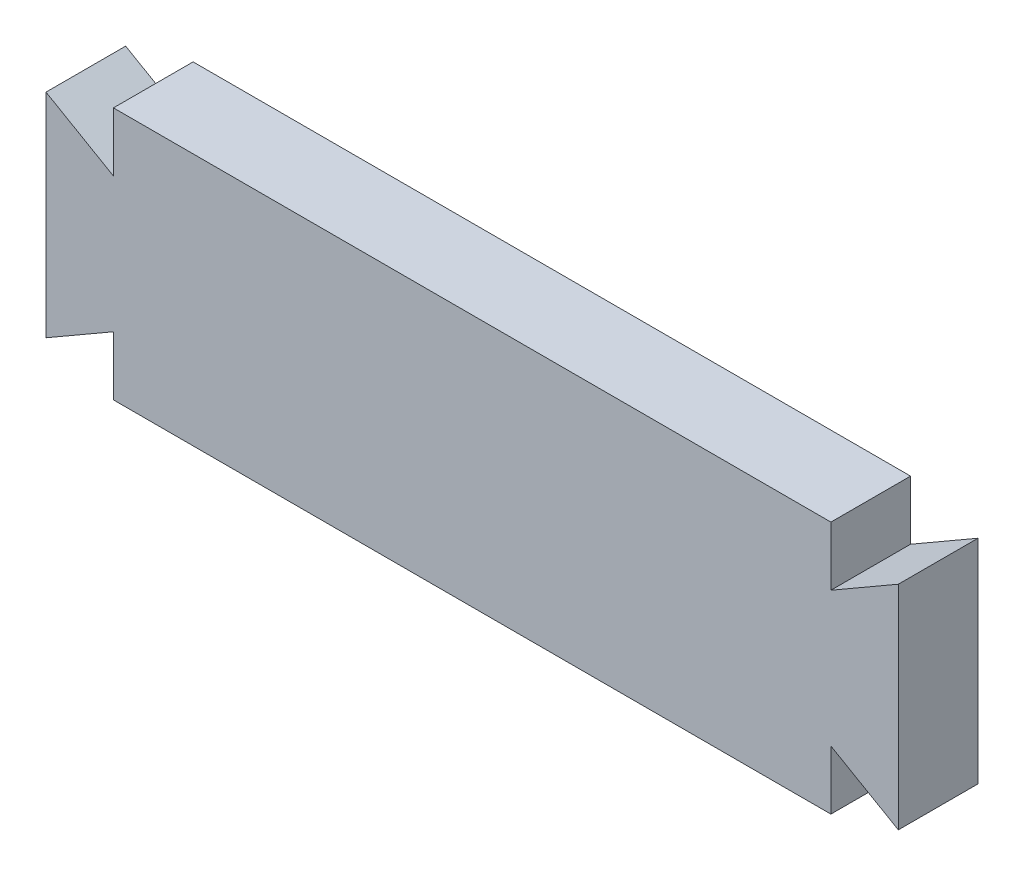
ISO-10303-21;
HEADER;
FILE_DESCRIPTION(('STEP AP214'),'2;1');
FILE_NAME('part.step','',(''),(''),'','','');
FILE_SCHEMA(('AUTOMOTIVE_DESIGN { 1 0 10303 214 1 1 1 1 }'));
ENDSEC;
DATA;
#1=APPLICATION_CONTEXT('core data for automotive mechanical design processes');
#2=APPLICATION_PROTOCOL_DEFINITION('international standard','automotive_design',2000,#1);
#3=PRODUCT_CONTEXT('',#1,'mechanical');
#4=PRODUCT('Part','Part','',(#3));
#5=PRODUCT_RELATED_PRODUCT_CATEGORY('part','',(#4));
#6=PRODUCT_DEFINITION_FORMATION('','',#4);
#7=PRODUCT_DEFINITION_CONTEXT('part definition',#1,'design');
#8=PRODUCT_DEFINITION('design','',#6,#7);
#9=PRODUCT_DEFINITION_SHAPE('','',#8);
#10=(LENGTH_UNIT() NAMED_UNIT(*) SI_UNIT(.MILLI.,.METRE.));
#11=(NAMED_UNIT(*) PLANE_ANGLE_UNIT() SI_UNIT($,.RADIAN.));
#12=(NAMED_UNIT(*) SI_UNIT($,.STERADIAN.) SOLID_ANGLE_UNIT());
#13=UNCERTAINTY_MEASURE_WITH_UNIT(LENGTH_MEASURE(1.E-05),#10,'distance_accuracy_value','');
#14=(GEOMETRIC_REPRESENTATION_CONTEXT(3) GLOBAL_UNCERTAINTY_ASSIGNED_CONTEXT((#13)) GLOBAL_UNIT_ASSIGNED_CONTEXT((#10,
#11,#12)) REPRESENTATION_CONTEXT('',''));
#15=CARTESIAN_POINT('',(0.,0.,0.));
#16=DIRECTION('',(0.,0.,1.));
#17=DIRECTION('',(1.,0.,0.));
#18=AXIS2_PLACEMENT_3D('',#15,#16,#17);
#19=CARTESIAN_POINT('',(-16.049999904,-4.00646968374167,1.500000048));
#20=DIRECTION('',(-0.500000000000005,0.866025403784436,0.));
#21=DIRECTION('',(-0.866025403784436,-0.500000000000005,0.));
#22=AXIS2_PLACEMENT_3D('',#19,#20,#21);
#23=PLANE('',#22);
#24=DIRECTION('',(0.866025403784436,0.500000000000005,0.));
#25=VECTOR('',#24,1.);
#26=CARTESIAN_POINT('',(-16.049999904,-4.00646968374167,-1.500000048));
#27=LINE('',#26,#25);
#28=CARTESIAN_POINT('',(-16.049999904,-4.00646968374167,-1.500000048));
#29=VERTEX_POINT('',#28);
#30=CARTESIAN_POINT('',(-13.509999904,-2.54,-1.500000048));
#31=VERTEX_POINT('',#30);
#32=EDGE_CURVE('E273',#29,#31,#27,.T.);
#33=ORIENTED_EDGE('',*,*,#32,.T.);
#34=DIRECTION('',(0.,0.,-1.));
#35=VECTOR('',#34,1.);
#36=CARTESIAN_POINT('',(-13.509999904,-2.54,1.500000048));
#37=LINE('',#36,#35);
#38=CARTESIAN_POINT('',(-13.509999904,-2.54,1.500000048));
#39=VERTEX_POINT('',#38);
#40=EDGE_CURVE('E12',#39,#31,#37,.T.);
#41=ORIENTED_EDGE('',*,*,#40,.F.);
#42=DIRECTION('',(0.866025403784436,0.500000000000005,0.));
#43=VECTOR('',#42,1.);
#44=CARTESIAN_POINT('',(-16.049999904,-4.00646968374167,1.500000048));
#45=LINE('',#44,#43);
#46=CARTESIAN_POINT('',(-16.049999904,-4.00646968374167,1.500000048));
#47=VERTEX_POINT('',#46);
#48=EDGE_CURVE('E211',#47,#39,#45,.T.);
#49=ORIENTED_EDGE('',*,*,#48,.F.);
#50=DIRECTION('',(0.,0.,-1.));
#51=VECTOR('',#50,1.);
#52=CARTESIAN_POINT('',(-16.049999904,-4.00646968374167,1.500000048));
#53=LINE('',#52,#51);
#54=EDGE_CURVE('E167',#47,#29,#53,.T.);
#55=ORIENTED_EDGE('',*,*,#54,.T.);
#56=EDGE_LOOP('',(#33,#41,#49,#55));
#57=FACE_BOUND('',#56,.T.);
#58=ADVANCED_FACE('F46',(#57),#23,.F.);
#59=CARTESIAN_POINT('',(-13.509999904,-2.54,1.500000048));
#60=DIRECTION('',(1.,0.,0.));
#61=DIRECTION('',(0.,0.,-1.));
#62=AXIS2_PLACEMENT_3D('',#59,#60,#61);
#63=PLANE('',#62);
#64=DIRECTION('',(0.,-1.,0.));
#65=VECTOR('',#64,1.);
#66=CARTESIAN_POINT('',(-13.509999904,-2.54,-1.500000048));
#67=LINE('',#66,#65);
#68=CARTESIAN_POINT('',(-13.509999904,-4.7625,-1.500000048));
#69=VERTEX_POINT('',#68);
#70=EDGE_CURVE('E264',#31,#69,#67,.T.);
#71=ORIENTED_EDGE('',*,*,#70,.T.);
#72=DIRECTION('',(0.,0.,-1.));
#73=VECTOR('',#72,1.);
#74=CARTESIAN_POINT('',(-13.509999904,-4.7625,1.500000048));
#75=LINE('',#74,#73);
#76=CARTESIAN_POINT('',(-13.509999904,-4.7625,1.500000048));
#77=VERTEX_POINT('',#76);
#78=EDGE_CURVE('E55',#77,#69,#75,.T.);
#79=ORIENTED_EDGE('',*,*,#78,.F.);
#80=DIRECTION('',(0.,-1.,0.));
#81=VECTOR('',#80,1.);
#82=CARTESIAN_POINT('',(-13.509999904,-2.54,1.500000048));
#83=LINE('',#82,#81);
#84=EDGE_CURVE('E118',#39,#77,#83,.T.);
#85=ORIENTED_EDGE('',*,*,#84,.F.);
#86=ORIENTED_EDGE('',*,*,#40,.T.);
#87=EDGE_LOOP('',(#71,#79,#85,#86));
#88=FACE_BOUND('',#87,.T.);
#89=ADVANCED_FACE('F309',(#88),#63,.F.);
#90=CARTESIAN_POINT('',(-13.509999904,-4.7625,1.500000048));
#91=DIRECTION('',(0.,1.,0.));
#92=DIRECTION('',(0.,0.,1.));
#93=AXIS2_PLACEMENT_3D('',#90,#91,#92);
#94=PLANE('',#93);
#95=DIRECTION('',(1.,0.,0.));
#96=VECTOR('',#95,1.);
#97=CARTESIAN_POINT('',(-13.509999904,-4.7625,-1.500000048));
#98=LINE('',#97,#96);
#99=CARTESIAN_POINT('',(13.509999904,-4.7625,-1.500000048));
#100=VERTEX_POINT('',#99);
#101=EDGE_CURVE('E259',#69,#100,#98,.T.);
#102=ORIENTED_EDGE('',*,*,#101,.T.);
#103=DIRECTION('',(0.,0.,-1.));
#104=VECTOR('',#103,1.);
#105=CARTESIAN_POINT('',(13.509999904,-4.7625,1.500000048));
#106=LINE('',#105,#104);
#107=CARTESIAN_POINT('',(13.509999904,-4.7625,1.500000048));
#108=VERTEX_POINT('',#107);
#109=EDGE_CURVE('E249',#108,#100,#106,.T.);
#110=ORIENTED_EDGE('',*,*,#109,.F.);
#111=DIRECTION('',(1.,0.,0.));
#112=VECTOR('',#111,1.);
#113=CARTESIAN_POINT('',(-13.509999904,-4.7625,1.500000048));
#114=LINE('',#113,#112);
#115=EDGE_CURVE('E203',#77,#108,#114,.T.);
#116=ORIENTED_EDGE('',*,*,#115,.F.);
#117=ORIENTED_EDGE('',*,*,#78,.T.);
#118=EDGE_LOOP('',(#102,#110,#116,#117));
#119=FACE_BOUND('',#118,.T.);
#120=ADVANCED_FACE('F257',(#119),#94,.F.);
#121=CARTESIAN_POINT('',(13.509999904,-4.7625,1.500000048));
#122=DIRECTION('',(-1.,0.,0.));
#123=DIRECTION('',(0.,0.,1.));
#124=AXIS2_PLACEMENT_3D('',#121,#122,#123);
#125=PLANE('',#124);
#126=DIRECTION('',(0.,1.,0.));
#127=VECTOR('',#126,1.);
#128=CARTESIAN_POINT('',(13.509999904,-4.7625,-1.500000048));
#129=LINE('',#128,#127);
#130=CARTESIAN_POINT('',(13.509999904,-2.54,-1.500000048));
#131=VERTEX_POINT('',#130);
#132=EDGE_CURVE('E266',#100,#131,#129,.T.);
#133=ORIENTED_EDGE('',*,*,#132,.T.);
#134=DIRECTION('',(0.,0.,-1.));
#135=VECTOR('',#134,1.);
#136=CARTESIAN_POINT('',(13.509999904,-2.54,1.500000048));
#137=LINE('',#136,#135);
#138=CARTESIAN_POINT('',(13.509999904,-2.54,1.500000048));
#139=VERTEX_POINT('',#138);
#140=EDGE_CURVE('E245',#139,#131,#137,.T.);
#141=ORIENTED_EDGE('',*,*,#140,.F.);
#142=DIRECTION('',(0.,1.,0.));
#143=VECTOR('',#142,1.);
#144=CARTESIAN_POINT('',(13.509999904,-4.7625,1.500000048));
#145=LINE('',#144,#143);
#146=EDGE_CURVE('E199',#108,#139,#145,.T.);
#147=ORIENTED_EDGE('',*,*,#146,.F.);
#148=ORIENTED_EDGE('',*,*,#109,.T.);
#149=EDGE_LOOP('',(#133,#141,#147,#148));
#150=FACE_BOUND('',#149,.T.);
#151=ADVANCED_FACE('F316',(#150),#125,.F.);
#152=CARTESIAN_POINT('',(13.509999904,-2.54,1.500000048));
#153=DIRECTION('',(0.500000000000005,0.866025403784436,0.));
#154=DIRECTION('',(-0.866025403784436,0.500000000000005,0.));
#155=AXIS2_PLACEMENT_3D('',#152,#153,#154);
#156=PLANE('',#155);
#157=DIRECTION('',(0.866025403784436,-0.500000000000005,0.));
#158=VECTOR('',#157,1.);
#159=CARTESIAN_POINT('',(13.509999904,-2.54,-1.500000048));
#160=LINE('',#159,#158);
#161=CARTESIAN_POINT('',(16.049999904,-4.00646968374167,-1.500000048));
#162=VERTEX_POINT('',#161);
#163=EDGE_CURVE('E271',#131,#162,#160,.T.);
#164=ORIENTED_EDGE('',*,*,#163,.T.);
#165=DIRECTION('',(0.,0.,-1.));
#166=VECTOR('',#165,1.);
#167=CARTESIAN_POINT('',(16.049999904,-4.00646968374167,1.500000048));
#168=LINE('',#167,#166);
#169=CARTESIAN_POINT('',(16.049999904,-4.00646968374167,1.500000048));
#170=VERTEX_POINT('',#169);
#171=EDGE_CURVE('E241',#170,#162,#168,.T.);
#172=ORIENTED_EDGE('',*,*,#171,.F.);
#173=DIRECTION('',(0.866025403784436,-0.500000000000005,0.));
#174=VECTOR('',#173,1.);
#175=CARTESIAN_POINT('',(13.509999904,-2.54,1.500000048));
#176=LINE('',#175,#174);
#177=EDGE_CURVE('E196',#139,#170,#176,.T.);
#178=ORIENTED_EDGE('',*,*,#177,.F.);
#179=ORIENTED_EDGE('',*,*,#140,.T.);
#180=EDGE_LOOP('',(#164,#172,#178,#179));
#181=FACE_BOUND('',#180,.T.);
#182=ADVANCED_FACE('F321',(#181),#156,.F.);
#183=CARTESIAN_POINT('',(16.049999904,4.00646968374167,1.500000048));
#184=DIRECTION('',(-1.,0.,0.));
#185=DIRECTION('',(0.,0.,1.));
#186=AXIS2_PLACEMENT_3D('',#183,#184,#185);
#187=PLANE('',#186);
#188=DIRECTION('',(0.,1.,0.));
#189=VECTOR('',#188,1.);
#190=CARTESIAN_POINT('',(16.049999904,4.00646968374167,-1.500000048));
#191=LINE('',#190,#189);
#192=CARTESIAN_POINT('',(16.049999904,4.00646968374167,-1.500000048));
#193=VERTEX_POINT('',#192);
#194=EDGE_CURVE('E278',#162,#193,#191,.T.);
#195=ORIENTED_EDGE('',*,*,#194,.T.);
#196=DIRECTION('',(0.,0.,-1.));
#197=VECTOR('',#196,1.);
#198=CARTESIAN_POINT('',(16.049999904,4.00646968374167,1.500000048));
#199=LINE('',#198,#197);
#200=CARTESIAN_POINT('',(16.049999904,4.00646968374167,1.500000048));
#201=VERTEX_POINT('',#200);
#202=EDGE_CURVE('E237',#201,#193,#199,.T.);
#203=ORIENTED_EDGE('',*,*,#202,.F.);
#204=DIRECTION('',(0.,1.,0.));
#205=VECTOR('',#204,1.);
#206=CARTESIAN_POINT('',(16.049999904,4.00646968374167,1.500000048));
#207=LINE('',#206,#205);
#208=EDGE_CURVE('E188',#170,#201,#207,.T.);
#209=ORIENTED_EDGE('',*,*,#208,.F.);
#210=ORIENTED_EDGE('',*,*,#171,.T.);
#211=EDGE_LOOP('',(#195,#203,#209,#210));
#212=FACE_BOUND('',#211,.T.);
#213=ADVANCED_FACE('F325',(#212),#187,.F.);
#214=CARTESIAN_POINT('',(13.509999904,2.54,1.500000048));
#215=DIRECTION('',(0.500000000000005,-0.866025403784436,0.));
#216=DIRECTION('',(0.866025403784436,0.500000000000005,0.));
#217=AXIS2_PLACEMENT_3D('',#214,#215,#216);
#218=PLANE('',#217);
#219=DIRECTION('',(-0.866025403784436,-0.500000000000005,0.));
#220=VECTOR('',#219,1.);
#221=CARTESIAN_POINT('',(13.509999904,2.54,-1.500000048));
#222=LINE('',#221,#220);
#223=CARTESIAN_POINT('',(13.509999904,2.54,-1.500000048));
#224=VERTEX_POINT('',#223);
#225=EDGE_CURVE('E281',#193,#224,#222,.T.);
#226=ORIENTED_EDGE('',*,*,#225,.T.);
#227=DIRECTION('',(0.,0.,-1.));
#228=VECTOR('',#227,1.);
#229=CARTESIAN_POINT('',(13.509999904,2.54,1.500000048));
#230=LINE('',#229,#228);
#231=CARTESIAN_POINT('',(13.509999904,2.54,1.500000048));
#232=VERTEX_POINT('',#231);
#233=EDGE_CURVE('E233',#232,#224,#230,.T.);
#234=ORIENTED_EDGE('',*,*,#233,.F.);
#235=DIRECTION('',(-0.866025403784436,-0.500000000000005,0.));
#236=VECTOR('',#235,1.);
#237=CARTESIAN_POINT('',(13.509999904,2.54,1.500000048));
#238=LINE('',#237,#236);
#239=EDGE_CURVE('E184',#201,#232,#238,.T.);
#240=ORIENTED_EDGE('',*,*,#239,.F.);
#241=ORIENTED_EDGE('',*,*,#202,.T.);
#242=EDGE_LOOP('',(#226,#234,#240,#241));
#243=FACE_BOUND('',#242,.T.);
#244=ADVANCED_FACE('F329',(#243),#218,.F.);
#245=CARTESIAN_POINT('',(13.509999904,4.7625,1.500000048));
#246=DIRECTION('',(-1.,0.,0.));
#247=DIRECTION('',(0.,0.,1.));
#248=AXIS2_PLACEMENT_3D('',#245,#246,#247);
#249=PLANE('',#248);
#250=DIRECTION('',(0.,1.,0.));
#251=VECTOR('',#250,1.);
#252=CARTESIAN_POINT('',(13.509999904,4.7625,-1.500000048));
#253=LINE('',#252,#251);
#254=CARTESIAN_POINT('',(13.509999904,4.7625,-1.500000048));
#255=VERTEX_POINT('',#254);
#256=EDGE_CURVE('E284',#224,#255,#253,.T.);
#257=ORIENTED_EDGE('',*,*,#256,.T.);
#258=DIRECTION('',(0.,0.,-1.));
#259=VECTOR('',#258,1.);
#260=CARTESIAN_POINT('',(13.509999904,4.7625,1.500000048));
#261=LINE('',#260,#259);
#262=CARTESIAN_POINT('',(13.509999904,4.7625,1.500000048));
#263=VERTEX_POINT('',#262);
#264=EDGE_CURVE('E229',#263,#255,#261,.T.);
#265=ORIENTED_EDGE('',*,*,#264,.F.);
#266=DIRECTION('',(0.,1.,0.));
#267=VECTOR('',#266,1.);
#268=CARTESIAN_POINT('',(13.509999904,4.7625,1.500000048));
#269=LINE('',#268,#267);
#270=EDGE_CURVE('E180',#232,#263,#269,.T.);
#271=ORIENTED_EDGE('',*,*,#270,.F.);
#272=ORIENTED_EDGE('',*,*,#233,.T.);
#273=EDGE_LOOP('',(#257,#265,#271,#272));
#274=FACE_BOUND('',#273,.T.);
#275=ADVANCED_FACE('F333',(#274),#249,.F.);
#276=CARTESIAN_POINT('',(-13.509999904,4.7625,1.500000048));
#277=DIRECTION('',(0.,-1.,0.));
#278=DIRECTION('',(0.,0.,-1.));
#279=AXIS2_PLACEMENT_3D('',#276,#277,#278);
#280=PLANE('',#279);
#281=DIRECTION('',(-1.,0.,0.));
#282=VECTOR('',#281,1.);
#283=CARTESIAN_POINT('',(-13.509999904,4.7625,-1.500000048));
#284=LINE('',#283,#282);
#285=CARTESIAN_POINT('',(-13.509999904,4.7625,-1.500000048));
#286=VERTEX_POINT('',#285);
#287=EDGE_CURVE('E287',#255,#286,#284,.T.);
#288=ORIENTED_EDGE('',*,*,#287,.T.);
#289=DIRECTION('',(0.,0.,-1.));
#290=VECTOR('',#289,1.);
#291=CARTESIAN_POINT('',(-13.509999904,4.7625,1.500000048));
#292=LINE('',#291,#290);
#293=CARTESIAN_POINT('',(-13.509999904,4.7625,1.500000048));
#294=VERTEX_POINT('',#293);
#295=EDGE_CURVE('E160',#294,#286,#292,.T.);
#296=ORIENTED_EDGE('',*,*,#295,.F.);
#297=DIRECTION('',(-1.,0.,0.));
#298=VECTOR('',#297,1.);
#299=CARTESIAN_POINT('',(-13.509999904,4.7625,1.500000048));
#300=LINE('',#299,#298);
#301=EDGE_CURVE('E149',#263,#294,#300,.T.);
#302=ORIENTED_EDGE('',*,*,#301,.F.);
#303=ORIENTED_EDGE('',*,*,#264,.T.);
#304=EDGE_LOOP('',(#288,#296,#302,#303));
#305=FACE_BOUND('',#304,.T.);
#306=ADVANCED_FACE('F292',(#305),#280,.F.);
#307=CARTESIAN_POINT('',(-13.509999904,2.54,1.500000048));
#308=DIRECTION('',(1.,0.,0.));
#309=DIRECTION('',(0.,0.,-1.));
#310=AXIS2_PLACEMENT_3D('',#307,#308,#309);
#311=PLANE('',#310);
#312=DIRECTION('',(0.,-1.,0.));
#313=VECTOR('',#312,1.);
#314=CARTESIAN_POINT('',(-13.509999904,2.54,-1.500000048));
#315=LINE('',#314,#313);
#316=CARTESIAN_POINT('',(-13.509999904,2.54,-1.500000048));
#317=VERTEX_POINT('',#316);
#318=EDGE_CURVE('E158',#286,#317,#315,.T.);
#319=ORIENTED_EDGE('',*,*,#318,.T.);
#320=DIRECTION('',(0.,0.,-1.));
#321=VECTOR('',#320,1.);
#322=CARTESIAN_POINT('',(-13.509999904,2.54,1.500000048));
#323=LINE('',#322,#321);
#324=CARTESIAN_POINT('',(-13.509999904,2.54,1.500000048));
#325=VERTEX_POINT('',#324);
#326=EDGE_CURVE('E155',#325,#317,#323,.T.);
#327=ORIENTED_EDGE('',*,*,#326,.F.);
#328=DIRECTION('',(0.,-1.,0.));
#329=VECTOR('',#328,1.);
#330=CARTESIAN_POINT('',(-13.509999904,2.54,1.500000048));
#331=LINE('',#330,#329);
#332=EDGE_CURVE('E143',#294,#325,#331,.T.);
#333=ORIENTED_EDGE('',*,*,#332,.F.);
#334=ORIENTED_EDGE('',*,*,#295,.T.);
#335=EDGE_LOOP('',(#319,#327,#333,#334));
#336=FACE_BOUND('',#335,.T.);
#337=ADVANCED_FACE('F156',(#336),#311,.F.);
#338=CARTESIAN_POINT('',(-16.049999904,4.00646968374167,1.500000048));
#339=DIRECTION('',(-0.500000000000005,-0.866025403784436,0.));
#340=DIRECTION('',(0.866025403784436,-0.500000000000005,0.));
#341=AXIS2_PLACEMENT_3D('',#338,#339,#340);
#342=PLANE('',#341);
#343=DIRECTION('',(-0.866025403784436,0.500000000000005,0.));
#344=VECTOR('',#343,1.);
#345=CARTESIAN_POINT('',(-16.049999904,4.00646968374167,-1.500000048));
#346=LINE('',#345,#344);
#347=CARTESIAN_POINT('',(-16.049999904,4.00646968374167,-1.500000048));
#348=VERTEX_POINT('',#347);
#349=EDGE_CURVE('E104',#317,#348,#346,.T.);
#350=ORIENTED_EDGE('',*,*,#349,.T.);
#351=DIRECTION('',(0.,0.,-1.));
#352=VECTOR('',#351,1.);
#353=CARTESIAN_POINT('',(-16.049999904,4.00646968374167,1.500000048));
#354=LINE('',#353,#352);
#355=CARTESIAN_POINT('',(-16.049999904,4.00646968374167,1.500000048));
#356=VERTEX_POINT('',#355);
#357=EDGE_CURVE('E161',#356,#348,#354,.T.);
#358=ORIENTED_EDGE('',*,*,#357,.F.);
#359=DIRECTION('',(-0.866025403784436,0.500000000000005,0.));
#360=VECTOR('',#359,1.);
#361=CARTESIAN_POINT('',(-16.049999904,4.00646968374167,1.500000048));
#362=LINE('',#361,#360);
#363=EDGE_CURVE('E147',#325,#356,#362,.T.);
#364=ORIENTED_EDGE('',*,*,#363,.F.);
#365=ORIENTED_EDGE('',*,*,#326,.T.);
#366=EDGE_LOOP('',(#350,#358,#364,#365));
#367=FACE_BOUND('',#366,.T.);
#368=ADVANCED_FACE('F163',(#367),#342,.F.);
#369=CARTESIAN_POINT('',(-16.049999904,-4.00646968374167,1.500000048));
#370=DIRECTION('',(1.,0.,0.));
#371=DIRECTION('',(0.,0.,-1.));
#372=AXIS2_PLACEMENT_3D('',#369,#370,#371);
#373=PLANE('',#372);
#374=DIRECTION('',(0.,-1.,0.));
#375=VECTOR('',#374,1.);
#376=CARTESIAN_POINT('',(-16.049999904,-4.00646968374167,-1.500000048));
#377=LINE('',#376,#375);
#378=EDGE_CURVE('E110',#348,#29,#377,.T.);
#379=ORIENTED_EDGE('',*,*,#378,.T.);
#380=ORIENTED_EDGE('',*,*,#54,.F.);
#381=DIRECTION('',(0.,-1.,0.));
#382=VECTOR('',#381,1.);
#383=CARTESIAN_POINT('',(-16.049999904,-4.00646968374167,1.500000048));
#384=LINE('',#383,#382);
#385=EDGE_CURVE('E63',#356,#47,#384,.T.);
#386=ORIENTED_EDGE('',*,*,#385,.F.);
#387=ORIENTED_EDGE('',*,*,#357,.T.);
#388=EDGE_LOOP('',(#379,#380,#386,#387));
#389=FACE_BOUND('',#388,.T.);
#390=ADVANCED_FACE('F298',(#389),#373,.F.);
#391=CARTESIAN_POINT('',(0.,0.,1.500000048));
#392=DIRECTION('',(0.,0.,-1.));
#393=DIRECTION('',(-1.,0.,0.));
#394=AXIS2_PLACEMENT_3D('',#391,#392,#393);
#395=PLANE('',#394);
#396=ORIENTED_EDGE('',*,*,#48,.T.);
#397=ORIENTED_EDGE('',*,*,#84,.T.);
#398=ORIENTED_EDGE('',*,*,#115,.T.);
#399=ORIENTED_EDGE('',*,*,#146,.T.);
#400=ORIENTED_EDGE('',*,*,#177,.T.);
#401=ORIENTED_EDGE('',*,*,#208,.T.);
#402=ORIENTED_EDGE('',*,*,#239,.T.);
#403=ORIENTED_EDGE('',*,*,#270,.T.);
#404=ORIENTED_EDGE('',*,*,#301,.T.);
#405=ORIENTED_EDGE('',*,*,#332,.T.);
#406=ORIENTED_EDGE('',*,*,#363,.T.);
#407=ORIENTED_EDGE('',*,*,#385,.T.);
#408=EDGE_LOOP('',(#396,#397,#398,#399,#400,#401,#402,#403,#404,#405,#406,#407));
#409=FACE_BOUND('',#408,.T.);
#410=ADVANCED_FACE('F145',(#409),#395,.F.);
#411=CARTESIAN_POINT('',(0.,0.,-1.500000048));
#412=DIRECTION('',(0.,0.,-1.));
#413=DIRECTION('',(-1.,0.,0.));
#414=AXIS2_PLACEMENT_3D('',#411,#412,#413);
#415=PLANE('',#414);
#416=ORIENTED_EDGE('',*,*,#32,.F.);
#417=ORIENTED_EDGE('',*,*,#378,.F.);
#418=ORIENTED_EDGE('',*,*,#349,.F.);
#419=ORIENTED_EDGE('',*,*,#318,.F.);
#420=ORIENTED_EDGE('',*,*,#287,.F.);
#421=ORIENTED_EDGE('',*,*,#256,.F.);
#422=ORIENTED_EDGE('',*,*,#225,.F.);
#423=ORIENTED_EDGE('',*,*,#194,.F.);
#424=ORIENTED_EDGE('',*,*,#163,.F.);
#425=ORIENTED_EDGE('',*,*,#132,.F.);
#426=ORIENTED_EDGE('',*,*,#101,.F.);
#427=ORIENTED_EDGE('',*,*,#70,.F.);
#428=EDGE_LOOP('',(#416,#417,#418,#419,#420,#421,#422,#423,#424,#425,#426,#427));
#429=FACE_BOUND('',#428,.T.);
#430=ADVANCED_FACE('F263',(#429),#415,.T.);
#431=CLOSED_SHELL('',(#58,#89,#120,#151,#182,#213,#244,#275,#306,#337,#368,#390,#410,#430));
#432=MANIFOLD_SOLID_BREP('B2',#431);
#433=ADVANCED_BREP_SHAPE_REPRESENTATION('',(#18,#432),#14);
#434=SHAPE_DEFINITION_REPRESENTATION(#9,#433);
ENDSEC;
END-ISO-10303-21;
